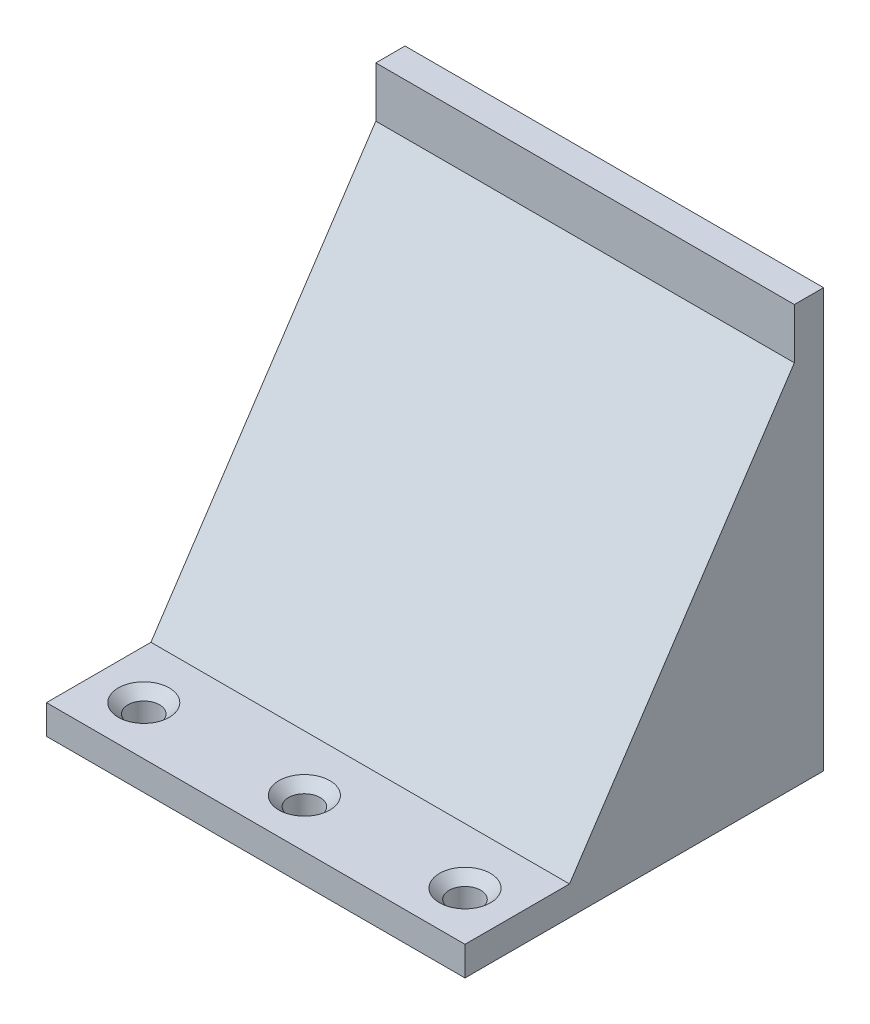
ISO-10303-21;
HEADER;
FILE_DESCRIPTION(('STEP AP214'),'2;1');
FILE_NAME('part.step','',(''),(''),'','','');
FILE_SCHEMA(('AUTOMOTIVE_DESIGN { 1 0 10303 214 1 1 1 1 }'));
ENDSEC;
DATA;
#1=APPLICATION_CONTEXT('core data for automotive mechanical design processes');
#2=APPLICATION_PROTOCOL_DEFINITION('international standard','automotive_design',2000,#1);
#3=PRODUCT_CONTEXT('',#1,'mechanical');
#4=PRODUCT('Part','Part','',(#3));
#5=PRODUCT_RELATED_PRODUCT_CATEGORY('part','',(#4));
#6=PRODUCT_DEFINITION_FORMATION('','',#4);
#7=PRODUCT_DEFINITION_CONTEXT('part definition',#1,'design');
#8=PRODUCT_DEFINITION('design','',#6,#7);
#9=PRODUCT_DEFINITION_SHAPE('','',#8);
#10=(LENGTH_UNIT() NAMED_UNIT(*) SI_UNIT(.MILLI.,.METRE.));
#11=(NAMED_UNIT(*) PLANE_ANGLE_UNIT() SI_UNIT($,.RADIAN.));
#12=(NAMED_UNIT(*) SI_UNIT($,.STERADIAN.) SOLID_ANGLE_UNIT());
#13=UNCERTAINTY_MEASURE_WITH_UNIT(LENGTH_MEASURE(1.E-05),#10,'distance_accuracy_value','');
#14=(GEOMETRIC_REPRESENTATION_CONTEXT(3) GLOBAL_UNCERTAINTY_ASSIGNED_CONTEXT((#13)) GLOBAL_UNIT_ASSIGNED_CONTEXT((#10,
#11,#12)) REPRESENTATION_CONTEXT('',''));
#15=CARTESIAN_POINT('',(0.,0.,0.));
#16=DIRECTION('',(0.,0.,1.));
#17=DIRECTION('',(1.,0.,0.));
#18=AXIS2_PLACEMENT_3D('',#15,#16,#17);
#19=CARTESIAN_POINT('',(21.5,21.5,3.));
#20=DIRECTION('',(-1.,0.,0.));
#21=DIRECTION('',(0.,-1.,0.));
#22=AXIS2_PLACEMENT_3D('',#19,#20,#21);
#23=PLANE('',#22);
#24=DIRECTION('',(0.,1.,0.));
#25=VECTOR('',#24,1.);
#26=CARTESIAN_POINT('',(21.5,21.5,0.));
#27=LINE('',#26,#25);
#28=CARTESIAN_POINT('',(21.5,-21.5,0.));
#29=VERTEX_POINT('',#28);
#30=CARTESIAN_POINT('',(21.5,21.5,0.));
#31=VERTEX_POINT('',#30);
#32=EDGE_CURVE('E93',#29,#31,#27,.T.);
#33=ORIENTED_EDGE('',*,*,#32,.T.);
#34=DIRECTION('',(0.,0.,-1.));
#35=VECTOR('',#34,1.);
#36=CARTESIAN_POINT('',(21.5,21.5,3.));
#37=LINE('',#36,#35);
#38=CARTESIAN_POINT('',(21.5,21.5,3.));
#39=VERTEX_POINT('',#38);
#40=EDGE_CURVE('E116',#39,#31,#37,.T.);
#41=ORIENTED_EDGE('',*,*,#40,.F.);
#42=DIRECTION('',(0.,1.,0.));
#43=VECTOR('',#42,1.);
#44=CARTESIAN_POINT('',(21.5,21.5,3.));
#45=LINE('',#44,#43);
#46=CARTESIAN_POINT('',(21.5,16.3134082911175,3.));
#47=VERTEX_POINT('',#46);
#48=EDGE_CURVE('E86',#47,#39,#45,.T.);
#49=ORIENTED_EDGE('',*,*,#48,.F.);
#50=DIRECTION('',(0.,0.833247230586757,-0.552900581225503));
#51=VECTOR('',#50,1.);
#52=CARTESIAN_POINT('',(21.5,-18.5,26.1004112249438));
#53=LINE('',#52,#51);
#54=CARTESIAN_POINT('',(21.5,-18.5,26.1004112249438));
#55=VERTEX_POINT('',#54);
#56=EDGE_CURVE('E190',#55,#47,#53,.T.);
#57=ORIENTED_EDGE('',*,*,#56,.F.);
#58=DIRECTION('',(0.,0.,-1.));
#59=VECTOR('',#58,1.);
#60=CARTESIAN_POINT('',(21.5,-18.5,26.1004112249438));
#61=LINE('',#60,#59);
#62=CARTESIAN_POINT('',(21.5,-18.5,36.8370313782031));
#63=VERTEX_POINT('',#62);
#64=EDGE_CURVE('E187',#63,#55,#61,.T.);
#65=ORIENTED_EDGE('',*,*,#64,.F.);
#66=DIRECTION('',(0.,1.,0.));
#67=VECTOR('',#66,1.);
#68=CARTESIAN_POINT('',(21.5,-21.5,36.8370313782031));
#69=LINE('',#68,#67);
#70=CARTESIAN_POINT('',(21.5,-21.5,36.8370313782031));
#71=VERTEX_POINT('',#70);
#72=EDGE_CURVE('E96',#71,#63,#69,.T.);
#73=ORIENTED_EDGE('',*,*,#72,.F.);
#74=DIRECTION('',(0.,0.,-1.));
#75=VECTOR('',#74,1.);
#76=CARTESIAN_POINT('',(21.5,-21.5,3.));
#77=LINE('',#76,#75);
#78=EDGE_CURVE('E79',#71,#29,#77,.T.);
#79=ORIENTED_EDGE('',*,*,#78,.T.);
#80=EDGE_LOOP('',(#33,#41,#49,#57,#65,#73,#79));
#81=FACE_BOUND('',#80,.T.);
#82=ADVANCED_FACE('F33',(#81),#23,.F.);
#83=CARTESIAN_POINT('',(-21.5,21.5,3.));
#84=DIRECTION('',(0.,-1.,0.));
#85=DIRECTION('',(0.,0.,-1.));
#86=AXIS2_PLACEMENT_3D('',#83,#84,#85);
#87=PLANE('',#86);
#88=DIRECTION('',(-1.,0.,0.));
#89=VECTOR('',#88,1.);
#90=CARTESIAN_POINT('',(-21.5,21.5,0.));
#91=LINE('',#90,#89);
#92=CARTESIAN_POINT('',(-21.5,21.5,0.));
#93=VERTEX_POINT('',#92);
#94=EDGE_CURVE('E100',#31,#93,#91,.T.);
#95=ORIENTED_EDGE('',*,*,#94,.T.);
#96=DIRECTION('',(0.,0.,-1.));
#97=VECTOR('',#96,1.);
#98=CARTESIAN_POINT('',(-21.5,21.5,3.));
#99=LINE('',#98,#97);
#100=CARTESIAN_POINT('',(-21.5,21.5,3.));
#101=VERTEX_POINT('',#100);
#102=EDGE_CURVE('E113',#101,#93,#99,.T.);
#103=ORIENTED_EDGE('',*,*,#102,.F.);
#104=DIRECTION('',(-1.,0.,0.));
#105=VECTOR('',#104,1.);
#106=CARTESIAN_POINT('',(-21.5,21.5,3.));
#107=LINE('',#106,#105);
#108=EDGE_CURVE('E54',#39,#101,#107,.T.);
#109=ORIENTED_EDGE('',*,*,#108,.F.);
#110=ORIENTED_EDGE('',*,*,#40,.T.);
#111=EDGE_LOOP('',(#95,#103,#109,#110));
#112=FACE_BOUND('',#111,.T.);
#113=ADVANCED_FACE('F144',(#112),#87,.F.);
#114=CARTESIAN_POINT('',(-21.5,21.5,3.));
#115=DIRECTION('',(1.,0.,0.));
#116=DIRECTION('',(0.,1.,0.));
#117=AXIS2_PLACEMENT_3D('',#114,#115,#116);
#118=PLANE('',#117);
#119=DIRECTION('',(0.,-1.,0.));
#120=VECTOR('',#119,1.);
#121=CARTESIAN_POINT('',(-21.5,21.5,0.));
#122=LINE('',#121,#120);
#123=CARTESIAN_POINT('',(-21.5,-21.5,0.));
#124=VERTEX_POINT('',#123);
#125=EDGE_CURVE('E87',#93,#124,#122,.T.);
#126=ORIENTED_EDGE('',*,*,#125,.T.);
#127=DIRECTION('',(0.,0.,-1.));
#128=VECTOR('',#127,1.);
#129=CARTESIAN_POINT('',(-21.5,-21.5,3.));
#130=LINE('',#129,#128);
#131=CARTESIAN_POINT('',(-21.5,-21.5,36.8370313782031));
#132=VERTEX_POINT('',#131);
#133=EDGE_CURVE('E82',#132,#124,#130,.T.);
#134=ORIENTED_EDGE('',*,*,#133,.F.);
#135=DIRECTION('',(0.,1.,0.));
#136=VECTOR('',#135,1.);
#137=CARTESIAN_POINT('',(-21.5,-21.5,36.8370313782031));
#138=LINE('',#137,#136);
#139=CARTESIAN_POINT('',(-21.5,-18.5,36.8370313782031));
#140=VERTEX_POINT('',#139);
#141=EDGE_CURVE('E191',#132,#140,#138,.T.);
#142=ORIENTED_EDGE('',*,*,#141,.T.);
#143=DIRECTION('',(0.,0.,-1.));
#144=VECTOR('',#143,1.);
#145=CARTESIAN_POINT('',(-21.5,-18.5,26.1004112249438));
#146=LINE('',#145,#144);
#147=CARTESIAN_POINT('',(-21.5,-18.5,26.1004112249438));
#148=VERTEX_POINT('',#147);
#149=EDGE_CURVE('E176',#140,#148,#146,.T.);
#150=ORIENTED_EDGE('',*,*,#149,.T.);
#151=DIRECTION('',(0.,0.833247230586757,-0.552900581225503));
#152=VECTOR('',#151,1.);
#153=CARTESIAN_POINT('',(-21.5,-18.5,26.1004112249438));
#154=LINE('',#153,#152);
#155=CARTESIAN_POINT('',(-21.5,16.3134082911175,3.));
#156=VERTEX_POINT('',#155);
#157=EDGE_CURVE('E180',#148,#156,#154,.T.);
#158=ORIENTED_EDGE('',*,*,#157,.T.);
#159=DIRECTION('',(0.,-1.,0.));
#160=VECTOR('',#159,1.);
#161=CARTESIAN_POINT('',(-21.5,21.5,3.));
#162=LINE('',#161,#160);
#163=EDGE_CURVE('E97',#101,#156,#162,.T.);
#164=ORIENTED_EDGE('',*,*,#163,.F.);
#165=ORIENTED_EDGE('',*,*,#102,.T.);
#166=EDGE_LOOP('',(#126,#134,#142,#150,#158,#164,#165));
#167=FACE_BOUND('',#166,.T.);
#168=ADVANCED_FACE('F149',(#167),#118,.F.);
#169=CARTESIAN_POINT('',(-21.5,-21.5,3.));
#170=DIRECTION('',(0.,1.,0.));
#171=DIRECTION('',(0.,0.,1.));
#172=AXIS2_PLACEMENT_3D('',#169,#170,#171);
#173=PLANE('',#172);
#174=CARTESIAN_POINT('',(-16.5,-21.5,31.8370313782034));
#175=DIRECTION('',(0.,1.,0.));
#176=DIRECTION('',(0.,0.,1.));
#177=AXIS2_PLACEMENT_3D('',#174,#175,#176);
#178=CIRCLE('',#177,1.62);
#179=CARTESIAN_POINT('',(-16.5,-21.5,33.4570313782034));
#180=VERTEX_POINT('',#179);
#181=EDGE_CURVE('E183',#180,#180,#178,.T.);
#182=ORIENTED_EDGE('',*,*,#181,.T.);
#183=EDGE_LOOP('',(#182));
#184=FACE_BOUND('',#183,.T.);
#185=CARTESIAN_POINT('',(0.,-21.5,31.8370313782033));
#186=DIRECTION('',(0.,1.,0.));
#187=DIRECTION('',(0.,0.,1.));
#188=AXIS2_PLACEMENT_3D('',#185,#186,#187);
#189=CIRCLE('',#188,1.62);
#190=CARTESIAN_POINT('',(0.,-21.5,33.4570313782033));
#191=VERTEX_POINT('',#190);
#192=EDGE_CURVE('E177',#191,#191,#189,.T.);
#193=ORIENTED_EDGE('',*,*,#192,.T.);
#194=EDGE_LOOP('',(#193));
#195=FACE_BOUND('',#194,.T.);
#196=CARTESIAN_POINT('',(16.5,-21.5,31.8370313782031));
#197=DIRECTION('',(0.,1.,0.));
#198=DIRECTION('',(0.,0.,1.));
#199=AXIS2_PLACEMENT_3D('',#196,#197,#198);
#200=CIRCLE('',#199,1.62);
#201=CARTESIAN_POINT('',(16.5,-21.5,33.4570313782031));
#202=VERTEX_POINT('',#201);
#203=EDGE_CURVE('E174',#202,#202,#200,.T.);
#204=ORIENTED_EDGE('',*,*,#203,.T.);
#205=EDGE_LOOP('',(#204));
#206=FACE_BOUND('',#205,.T.);
#207=DIRECTION('',(1.,0.,0.));
#208=VECTOR('',#207,1.);
#209=CARTESIAN_POINT('',(-21.5,-21.5,0.));
#210=LINE('',#209,#208);
#211=EDGE_CURVE('E74',#124,#29,#210,.T.);
#212=ORIENTED_EDGE('',*,*,#211,.T.);
#213=ORIENTED_EDGE('',*,*,#78,.F.);
#214=DIRECTION('',(-1.,0.,0.));
#215=VECTOR('',#214,1.);
#216=CARTESIAN_POINT('',(21.5,-21.5,36.8370313782031));
#217=LINE('',#216,#215);
#218=EDGE_CURVE('E106',#71,#132,#217,.T.);
#219=ORIENTED_EDGE('',*,*,#218,.T.);
#220=ORIENTED_EDGE('',*,*,#133,.T.);
#221=EDGE_LOOP('',(#212,#213,#219,#220));
#222=FACE_BOUND('',#221,.T.);
#223=ADVANCED_FACE('F76',(#184,#195,#206,#222),#173,.F.);
#224=CARTESIAN_POINT('',(0.,0.,3.));
#225=DIRECTION('',(0.,0.,1.));
#226=DIRECTION('',(1.,0.,0.));
#227=AXIS2_PLACEMENT_3D('',#224,#225,#226);
#228=PLANE('',#227);
#229=DIRECTION('',(-1.,0.,0.));
#230=VECTOR('',#229,1.);
#231=CARTESIAN_POINT('',(21.5,16.3134082911176,3.));
#232=LINE('',#231,#230);
#233=EDGE_CURVE('E48',#47,#156,#232,.T.);
#234=ORIENTED_EDGE('',*,*,#233,.F.);
#235=ORIENTED_EDGE('',*,*,#48,.T.);
#236=ORIENTED_EDGE('',*,*,#108,.T.);
#237=ORIENTED_EDGE('',*,*,#163,.T.);
#238=EDGE_LOOP('',(#234,#235,#236,#237));
#239=FACE_BOUND('',#238,.T.);
#240=ADVANCED_FACE('F206',(#239),#228,.T.);
#241=CARTESIAN_POINT('',(0.,0.,0.));
#242=DIRECTION('',(0.,0.,1.));
#243=DIRECTION('',(1.,0.,0.));
#244=AXIS2_PLACEMENT_3D('',#241,#242,#243);
#245=PLANE('',#244);
#246=ORIENTED_EDGE('',*,*,#32,.F.);
#247=ORIENTED_EDGE('',*,*,#211,.F.);
#248=ORIENTED_EDGE('',*,*,#125,.F.);
#249=ORIENTED_EDGE('',*,*,#94,.F.);
#250=EDGE_LOOP('',(#246,#247,#248,#249));
#251=FACE_BOUND('',#250,.T.);
#252=ADVANCED_FACE('F99',(#251),#245,.F.);
#253=CARTESIAN_POINT('',(21.5,-18.5,26.1004112249438));
#254=DIRECTION('',(0.,1.,0.));
#255=DIRECTION('',(-1.,0.,0.));
#256=AXIS2_PLACEMENT_3D('',#253,#254,#255);
#257=PLANE('',#256);
#258=CARTESIAN_POINT('',(-16.5,-18.5,31.8370313782034));
#259=DIRECTION('',(0.,1.,0.));
#260=DIRECTION('',(-1.,0.,0.));
#261=AXIS2_PLACEMENT_3D('',#258,#259,#260);
#262=CIRCLE('',#261,2.61999999999996);
#263=CARTESIAN_POINT('',(-19.12,-18.5,31.8370313782034));
#264=VERTEX_POINT('',#263);
#265=EDGE_CURVE('E11',#264,#264,#262,.F.);
#266=ORIENTED_EDGE('',*,*,#265,.T.);
#267=EDGE_LOOP('',(#266));
#268=FACE_BOUND('',#267,.T.);
#269=CARTESIAN_POINT('',(0.,-18.5,31.8370313782033));
#270=DIRECTION('',(0.,1.,0.));
#271=DIRECTION('',(-1.,0.,0.));
#272=AXIS2_PLACEMENT_3D('',#269,#270,#271);
#273=CIRCLE('',#272,2.61999999999996);
#274=CARTESIAN_POINT('',(-2.61999999999996,-18.5,31.8370313782033));
#275=VERTEX_POINT('',#274);
#276=EDGE_CURVE('E127',#275,#275,#273,.F.);
#277=ORIENTED_EDGE('',*,*,#276,.T.);
#278=EDGE_LOOP('',(#277));
#279=FACE_BOUND('',#278,.T.);
#280=CARTESIAN_POINT('',(16.5,-18.5,31.8370313782031));
#281=DIRECTION('',(0.,1.,0.));
#282=DIRECTION('',(-1.,0.,0.));
#283=AXIS2_PLACEMENT_3D('',#280,#281,#282);
#284=CIRCLE('',#283,2.61999999999997);
#285=CARTESIAN_POINT('',(13.88,-18.5,31.8370313782031));
#286=VERTEX_POINT('',#285);
#287=EDGE_CURVE('E121',#286,#286,#284,.F.);
#288=ORIENTED_EDGE('',*,*,#287,.T.);
#289=EDGE_LOOP('',(#288));
#290=FACE_BOUND('',#289,.T.);
#291=ORIENTED_EDGE('',*,*,#149,.F.);
#292=DIRECTION('',(-1.,0.,0.));
#293=VECTOR('',#292,1.);
#294=CARTESIAN_POINT('',(21.5,-18.5,36.8370313782031));
#295=LINE('',#294,#293);
#296=EDGE_CURVE('E102',#63,#140,#295,.T.);
#297=ORIENTED_EDGE('',*,*,#296,.F.);
#298=ORIENTED_EDGE('',*,*,#64,.T.);
#299=DIRECTION('',(-1.,0.,0.));
#300=VECTOR('',#299,1.);
#301=CARTESIAN_POINT('',(21.5,-18.5,26.1004112249438));
#302=LINE('',#301,#300);
#303=EDGE_CURVE('E194',#55,#148,#302,.T.);
#304=ORIENTED_EDGE('',*,*,#303,.T.);
#305=EDGE_LOOP('',(#291,#297,#298,#304));
#306=FACE_BOUND('',#305,.T.);
#307=ADVANCED_FACE('F221',(#268,#279,#290,#306),#257,.T.);
#308=CARTESIAN_POINT('',(21.5,-21.5,36.8370313782031));
#309=DIRECTION('',(0.,0.,1.));
#310=DIRECTION('',(1.,0.,0.));
#311=AXIS2_PLACEMENT_3D('',#308,#309,#310);
#312=PLANE('',#311);
#313=ORIENTED_EDGE('',*,*,#141,.F.);
#314=ORIENTED_EDGE('',*,*,#218,.F.);
#315=ORIENTED_EDGE('',*,*,#72,.T.);
#316=ORIENTED_EDGE('',*,*,#296,.T.);
#317=EDGE_LOOP('',(#313,#314,#315,#316));
#318=FACE_BOUND('',#317,.T.);
#319=ADVANCED_FACE('F228',(#318),#312,.T.);
#320=CARTESIAN_POINT('',(21.5,-18.5,26.1004112249438));
#321=DIRECTION('',(0.,0.552900581225503,0.833247230586757));
#322=DIRECTION('',(0.,-0.833247230586757,0.552900581225503));
#323=AXIS2_PLACEMENT_3D('',#320,#321,#322);
#324=PLANE('',#323);
#325=ORIENTED_EDGE('',*,*,#157,.F.);
#326=ORIENTED_EDGE('',*,*,#303,.F.);
#327=ORIENTED_EDGE('',*,*,#56,.T.);
#328=ORIENTED_EDGE('',*,*,#233,.T.);
#329=EDGE_LOOP('',(#325,#326,#327,#328));
#330=FACE_BOUND('',#329,.T.);
#331=ADVANCED_FACE('F165',(#330),#324,.T.);
#332=CARTESIAN_POINT('',(16.5,-61.5,31.8370313782031));
#333=DIRECTION('',(0.,1.,0.));
#334=DIRECTION('',(-1.,0.,0.));
#335=AXIS2_PLACEMENT_3D('',#332,#333,#334);
#336=CYLINDRICAL_SURFACE('',#335,1.62);
#337=CARTESIAN_POINT('',(16.5,-19.5,31.8370313782031));
#338=DIRECTION('',(0.,1.,0.));
#339=DIRECTION('',(0.,0.,1.));
#340=AXIS2_PLACEMENT_3D('',#337,#338,#339);
#341=CIRCLE('',#340,1.62);
#342=CARTESIAN_POINT('',(16.5,-19.5,33.4570313782031));
#343=VERTEX_POINT('',#342);
#344=EDGE_CURVE('E118',#343,#343,#341,.T.);
#345=ORIENTED_EDGE('',*,*,#344,.T.);
#346=EDGE_LOOP('',(#345));
#347=FACE_BOUND('',#346,.T.);
#348=ORIENTED_EDGE('',*,*,#203,.F.);
#349=EDGE_LOOP('',(#348));
#350=FACE_BOUND('',#349,.T.);
#351=ADVANCED_FACE('F157',(#347,#350),#336,.F.);
#352=CARTESIAN_POINT('',(16.5,-19.5,31.8370313782031));
#353=DIRECTION('',(0.,1.,0.));
#354=DIRECTION('',(0.,0.,1.));
#355=AXIS2_PLACEMENT_3D('',#352,#353,#354);
#356=CONICAL_SURFACE('',#355,1.62,0.785398163397447);
#357=ORIENTED_EDGE('',*,*,#287,.F.);
#358=EDGE_LOOP('',(#357));
#359=FACE_BOUND('',#358,.T.);
#360=ORIENTED_EDGE('',*,*,#344,.F.);
#361=EDGE_LOOP('',(#360));
#362=FACE_BOUND('',#361,.T.);
#363=ADVANCED_FACE('F154',(#359,#362),#356,.F.);
#364=CARTESIAN_POINT('',(0.,-61.5,31.8370313782033));
#365=DIRECTION('',(0.,1.,0.));
#366=DIRECTION('',(-1.,0.,0.));
#367=AXIS2_PLACEMENT_3D('',#364,#365,#366);
#368=CYLINDRICAL_SURFACE('',#367,1.62);
#369=CARTESIAN_POINT('',(0.,-19.4999999999999,31.8370313782033));
#370=DIRECTION('',(0.,1.,0.));
#371=DIRECTION('',(-1.,0.,0.));
#372=AXIS2_PLACEMENT_3D('',#369,#370,#371);
#373=CIRCLE('',#372,1.62);
#374=CARTESIAN_POINT('',(-1.62,-19.4999999999999,31.8370313782033));
#375=VERTEX_POINT('',#374);
#376=EDGE_CURVE('E124',#375,#375,#373,.T.);
#377=ORIENTED_EDGE('',*,*,#376,.T.);
#378=EDGE_LOOP('',(#377));
#379=FACE_BOUND('',#378,.T.);
#380=ORIENTED_EDGE('',*,*,#192,.F.);
#381=EDGE_LOOP('',(#380));
#382=FACE_BOUND('',#381,.T.);
#383=ADVANCED_FACE('F156',(#379,#382),#368,.F.);
#384=CARTESIAN_POINT('',(-16.5,-61.5,31.8370313782034));
#385=DIRECTION('',(0.,1.,0.));
#386=DIRECTION('',(-1.,0.,0.));
#387=AXIS2_PLACEMENT_3D('',#384,#385,#386);
#388=CYLINDRICAL_SURFACE('',#387,1.62);
#389=CARTESIAN_POINT('',(-16.5,-19.5,31.8370313782034));
#390=DIRECTION('',(0.,1.,0.));
#391=DIRECTION('',(0.,0.,1.));
#392=AXIS2_PLACEMENT_3D('',#389,#390,#391);
#393=CIRCLE('',#392,1.62);
#394=CARTESIAN_POINT('',(-16.5,-19.5,33.4570313782034));
#395=VERTEX_POINT('',#394);
#396=EDGE_CURVE('E41',#395,#395,#393,.T.);
#397=ORIENTED_EDGE('',*,*,#396,.T.);
#398=EDGE_LOOP('',(#397));
#399=FACE_BOUND('',#398,.T.);
#400=ORIENTED_EDGE('',*,*,#181,.F.);
#401=EDGE_LOOP('',(#400));
#402=FACE_BOUND('',#401,.T.);
#403=ADVANCED_FACE('F132',(#399,#402),#388,.F.);
#404=CARTESIAN_POINT('',(0.,-19.4999999999999,31.8370313782033));
#405=DIRECTION('',(0.,1.,0.));
#406=DIRECTION('',(-1.,0.,0.));
#407=AXIS2_PLACEMENT_3D('',#404,#405,#406);
#408=CONICAL_SURFACE('',#407,1.62,0.785398163397447);
#409=ORIENTED_EDGE('',*,*,#276,.F.);
#410=EDGE_LOOP('',(#409));
#411=FACE_BOUND('',#410,.T.);
#412=ORIENTED_EDGE('',*,*,#376,.F.);
#413=EDGE_LOOP('',(#412));
#414=FACE_BOUND('',#413,.T.);
#415=ADVANCED_FACE('F136',(#411,#414),#408,.F.);
#416=CARTESIAN_POINT('',(-16.5,-19.5,31.8370313782034));
#417=DIRECTION('',(0.,1.,0.));
#418=DIRECTION('',(0.,0.,1.));
#419=AXIS2_PLACEMENT_3D('',#416,#417,#418);
#420=CONICAL_SURFACE('',#419,1.62,0.785398163397446);
#421=ORIENTED_EDGE('',*,*,#265,.F.);
#422=EDGE_LOOP('',(#421));
#423=FACE_BOUND('',#422,.T.);
#424=ORIENTED_EDGE('',*,*,#396,.F.);
#425=EDGE_LOOP('',(#424));
#426=FACE_BOUND('',#425,.T.);
#427=ADVANCED_FACE('F35',(#423,#426),#420,.F.);
#428=CLOSED_SHELL('',(#82,#113,#168,#223,#240,#252,#307,#319,#331,#351,#363,#383,#403,#415,#427));
#429=MANIFOLD_SOLID_BREP('B2',#428);
#430=ADVANCED_BREP_SHAPE_REPRESENTATION('',(#18,#429),#14);
#431=SHAPE_DEFINITION_REPRESENTATION(#9,#430);
ENDSEC;
END-ISO-10303-21;
